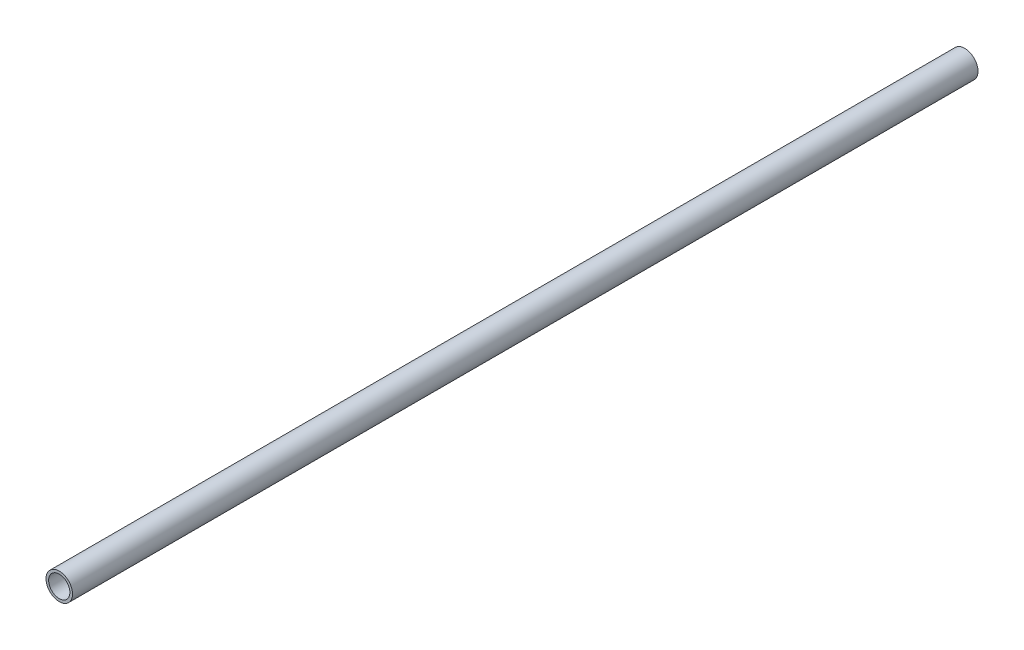
ISO-10303-21;
HEADER;
FILE_DESCRIPTION(('STEP AP214'),'2;1');
FILE_NAME('part.step','',(''),(''),'','','');
FILE_SCHEMA(('AUTOMOTIVE_DESIGN { 1 0 10303 214 1 1 1 1 }'));
ENDSEC;
DATA;
#1=APPLICATION_CONTEXT('core data for automotive mechanical design processes');
#2=APPLICATION_PROTOCOL_DEFINITION('international standard','automotive_design',2000,#1);
#3=PRODUCT_CONTEXT('',#1,'mechanical');
#4=PRODUCT('Part','Part','',(#3));
#5=PRODUCT_RELATED_PRODUCT_CATEGORY('part','',(#4));
#6=PRODUCT_DEFINITION_FORMATION('','',#4);
#7=PRODUCT_DEFINITION_CONTEXT('part definition',#1,'design');
#8=PRODUCT_DEFINITION('design','',#6,#7);
#9=PRODUCT_DEFINITION_SHAPE('','',#8);
#10=(LENGTH_UNIT() NAMED_UNIT(*) SI_UNIT(.MILLI.,.METRE.));
#11=(NAMED_UNIT(*) PLANE_ANGLE_UNIT() SI_UNIT($,.RADIAN.));
#12=(NAMED_UNIT(*) SI_UNIT($,.STERADIAN.) SOLID_ANGLE_UNIT());
#13=UNCERTAINTY_MEASURE_WITH_UNIT(LENGTH_MEASURE(1.E-05),#10,'distance_accuracy_value','');
#14=(GEOMETRIC_REPRESENTATION_CONTEXT(3) GLOBAL_UNCERTAINTY_ASSIGNED_CONTEXT((#13)) GLOBAL_UNIT_ASSIGNED_CONTEXT((#10,
#11,#12)) REPRESENTATION_CONTEXT('',''));
#15=CARTESIAN_POINT('',(0.,0.,0.));
#16=DIRECTION('',(0.,0.,1.));
#17=DIRECTION('',(1.,0.,0.));
#18=AXIS2_PLACEMENT_3D('',#15,#16,#17);
#19=CARTESIAN_POINT('',(0.,0.,40.7745115065571));
#20=DIRECTION('',(0.,0.,-1.));
#21=DIRECTION('',(0.,1.,0.));
#22=AXIS2_PLACEMENT_3D('',#19,#20,#21);
#23=PLANE('',#22);
#24=CARTESIAN_POINT('',(0.,0.,40.7745115065571));
#25=DIRECTION('',(0.,0.,-1.));
#26=DIRECTION('',(0.,1.,0.));
#27=AXIS2_PLACEMENT_3D('',#24,#25,#26);
#28=CIRCLE('',#27,7.93750000000012);
#29=CARTESIAN_POINT('',(0.,7.93750000000009,40.7745115065571));
#30=VERTEX_POINT('',#29);
#31=EDGE_CURVE('E42',#30,#30,#28,.T.);
#32=ORIENTED_EDGE('',*,*,#31,.F.);
#33=EDGE_LOOP('',(#32));
#34=FACE_BOUND('',#33,.T.);
#35=CARTESIAN_POINT('',(0.,0.,40.7745115065571));
#36=DIRECTION('',(0.,0.,-1.));
#37=DIRECTION('',(0.,1.,0.));
#38=AXIS2_PLACEMENT_3D('',#35,#36,#37);
#39=CIRCLE('',#38,6.35000000000002);
#40=CARTESIAN_POINT('',(0.,6.34999999999999,40.7745115065571));
#41=VERTEX_POINT('',#40);
#42=EDGE_CURVE('E51',#41,#41,#39,.T.);
#43=ORIENTED_EDGE('',*,*,#42,.T.);
#44=EDGE_LOOP('',(#43));
#45=FACE_BOUND('',#44,.T.);
#46=ADVANCED_FACE('F35',(#34,#45),#23,.F.);
#47=CARTESIAN_POINT('',(1.32622430219296E-13,1.57241791097654E-13,-523.703565684893));
#48=DIRECTION('',(0.,0.,1.));
#49=DIRECTION('',(0.,-1.,0.));
#50=AXIS2_PLACEMENT_3D('',#47,#48,#49);
#51=CYLINDRICAL_SURFACE('',#50,7.93750000000012);
#52=CARTESIAN_POINT('',(1.27170039252265E-13,1.49765349199533E-13,-501.25292538222));
#53=DIRECTION('',(0.,0.,1.));
#54=DIRECTION('',(0.,-1.,0.));
#55=AXIS2_PLACEMENT_3D('',#52,#53,#54);
#56=CIRCLE('',#55,7.93750000000012);
#57=CARTESIAN_POINT('',(1.27170039252265E-13,-7.93749999999997,-501.25292538222));
#58=VERTEX_POINT('',#57);
#59=EDGE_CURVE('E46',#58,#58,#56,.T.);
#60=ORIENTED_EDGE('',*,*,#59,.T.);
#61=EDGE_LOOP('',(#60));
#62=FACE_BOUND('',#61,.T.);
#63=ORIENTED_EDGE('',*,*,#31,.T.);
#64=EDGE_LOOP('',(#63));
#65=FACE_BOUND('',#64,.T.);
#66=ADVANCED_FACE('F59',(#62,#65),#51,.T.);
#67=CARTESIAN_POINT('',(1.32622430219296E-13,1.57241791097654E-13,-523.703565684893));
#68=DIRECTION('',(0.,0.,1.));
#69=DIRECTION('',(0.,-1.,0.));
#70=AXIS2_PLACEMENT_3D('',#67,#68,#69);
#71=CYLINDRICAL_SURFACE('',#70,6.35000000000002);
#72=CARTESIAN_POINT('',(1.27170039252265E-13,1.49765349199533E-13,-501.25292538222));
#73=DIRECTION('',(0.,0.,1.));
#74=DIRECTION('',(0.,-1.,0.));
#75=AXIS2_PLACEMENT_3D('',#72,#73,#74);
#76=CIRCLE('',#75,6.35000000000002);
#77=CARTESIAN_POINT('',(1.27170039252265E-13,-6.34999999999987,-501.25292538222));
#78=VERTEX_POINT('',#77);
#79=EDGE_CURVE('E10',#78,#78,#76,.T.);
#80=ORIENTED_EDGE('',*,*,#79,.F.);
#81=EDGE_LOOP('',(#80));
#82=FACE_BOUND('',#81,.T.);
#83=ORIENTED_EDGE('',*,*,#42,.F.);
#84=EDGE_LOOP('',(#83));
#85=FACE_BOUND('',#84,.T.);
#86=ADVANCED_FACE('F57',(#82,#85),#71,.F.);
#87=CARTESIAN_POINT('',(1.10392881273709E-13,1.50415405454056E-13,-501.25292538222));
#88=DIRECTION('',(0.,0.,1.));
#89=DIRECTION('',(-0.770834281376813,0.637035721646982,0.));
#90=AXIS2_PLACEMENT_3D('',#87,#88,#89);
#91=PLANE('',#90);
#92=ORIENTED_EDGE('',*,*,#79,.T.);
#93=EDGE_LOOP('',(#92));
#94=FACE_BOUND('',#93,.T.);
#95=ORIENTED_EDGE('',*,*,#59,.F.);
#96=EDGE_LOOP('',(#95));
#97=FACE_BOUND('',#96,.T.);
#98=ADVANCED_FACE('F37',(#94,#97),#91,.F.);
#99=CLOSED_SHELL('',(#46,#66,#86,#98));
#100=MANIFOLD_SOLID_BREP('B2',#99);
#101=ADVANCED_BREP_SHAPE_REPRESENTATION('',(#18,#100),#14);
#102=SHAPE_DEFINITION_REPRESENTATION(#9,#101);
ENDSEC;
END-ISO-10303-21;
